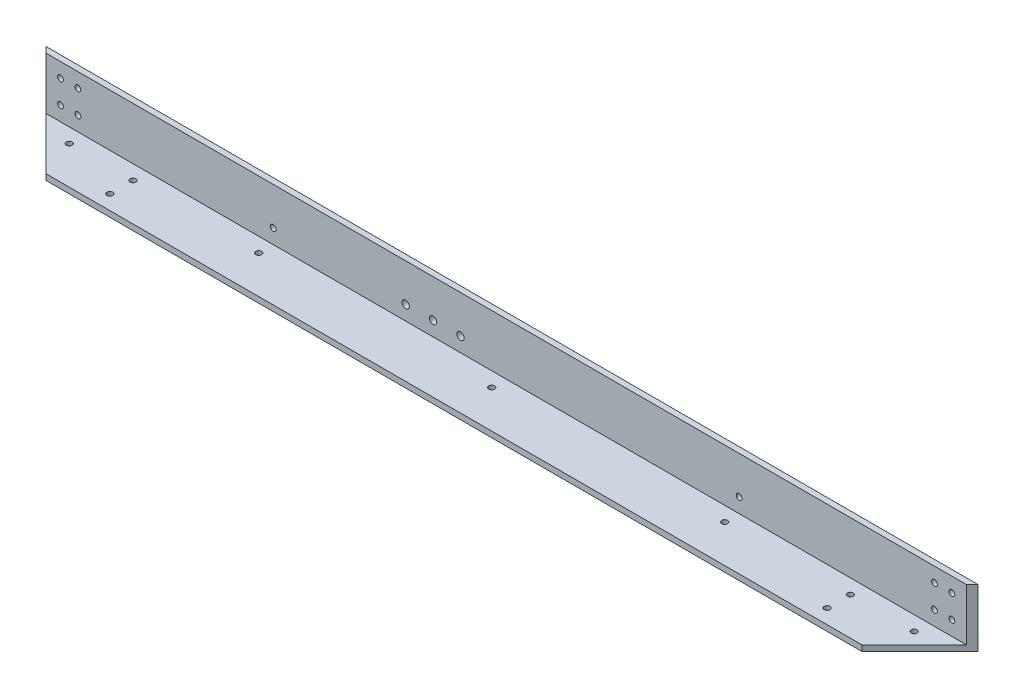
ISO-10303-21;
HEADER;
FILE_DESCRIPTION(('STEP AP214'),'2;1');
FILE_NAME('part.step','',(''),(''),'','','');
FILE_SCHEMA(('AUTOMOTIVE_DESIGN { 1 0 10303 214 1 1 1 1 }'));
ENDSEC;
DATA;
#1=APPLICATION_CONTEXT('core data for automotive mechanical design processes');
#2=APPLICATION_PROTOCOL_DEFINITION('international standard','automotive_design',2000,#1);
#3=PRODUCT_CONTEXT('',#1,'mechanical');
#4=PRODUCT('Part','Part','',(#3));
#5=PRODUCT_RELATED_PRODUCT_CATEGORY('part','',(#4));
#6=PRODUCT_DEFINITION_FORMATION('','',#4);
#7=PRODUCT_DEFINITION_CONTEXT('part definition',#1,'design');
#8=PRODUCT_DEFINITION('design','',#6,#7);
#9=PRODUCT_DEFINITION_SHAPE('','',#8);
#10=(LENGTH_UNIT() NAMED_UNIT(*) SI_UNIT(.MILLI.,.METRE.));
#11=(NAMED_UNIT(*) PLANE_ANGLE_UNIT() SI_UNIT($,.RADIAN.));
#12=(NAMED_UNIT(*) SI_UNIT($,.STERADIAN.) SOLID_ANGLE_UNIT());
#13=UNCERTAINTY_MEASURE_WITH_UNIT(LENGTH_MEASURE(1.E-05),#10,'distance_accuracy_value','');
#14=(GEOMETRIC_REPRESENTATION_CONTEXT(3) GLOBAL_UNCERTAINTY_ASSIGNED_CONTEXT((#13)) GLOBAL_UNIT_ASSIGNED_CONTEXT((#10,
#11,#12)) REPRESENTATION_CONTEXT('',''));
#15=CARTESIAN_POINT('',(0.,0.,0.));
#16=DIRECTION('',(0.,0.,1.));
#17=DIRECTION('',(1.,0.,0.));
#18=AXIS2_PLACEMENT_3D('',#15,#16,#17);
#19=CARTESIAN_POINT('',(510.,31.75,0.));
#20=DIRECTION('',(0.,0.,1.));
#21=DIRECTION('',(0.,-1.,0.));
#22=AXIS2_PLACEMENT_3D('',#19,#20,#21);
#23=PLANE('',#22);
#24=CARTESIAN_POINT('',(20.6375,11.1125,0.));
#25=DIRECTION('',(0.,0.,1.));
#26=DIRECTION('',(1.,0.,0.));
#27=AXIS2_PLACEMENT_3D('',#24,#25,#26);
#28=CIRCLE('',#27,1.5875);
#29=CARTESIAN_POINT('',(22.225,11.1125,0.));
#30=VERTEX_POINT('',#29);
#31=EDGE_CURVE('E325',#30,#30,#28,.T.);
#32=ORIENTED_EDGE('',*,*,#31,.T.);
#33=EDGE_LOOP('',(#32));
#34=FACE_BOUND('',#33,.T.);
#35=CARTESIAN_POINT('',(489.3625,11.1125,0.));
#36=DIRECTION('',(0.,0.,1.));
#37=DIRECTION('',(1.,0.,0.));
#38=AXIS2_PLACEMENT_3D('',#35,#36,#37);
#39=CIRCLE('',#38,1.58750000000004);
#40=CARTESIAN_POINT('',(490.95,11.1125,0.));
#41=VERTEX_POINT('',#40);
#42=EDGE_CURVE('E312',#41,#41,#39,.T.);
#43=ORIENTED_EDGE('',*,*,#42,.T.);
#44=EDGE_LOOP('',(#43));
#45=FACE_BOUND('',#44,.T.);
#46=CARTESIAN_POINT('',(498.8875,11.1125,0.));
#47=DIRECTION('',(0.,0.,1.));
#48=DIRECTION('',(1.,0.,0.));
#49=AXIS2_PLACEMENT_3D('',#46,#47,#48);
#50=CIRCLE('',#49,1.58749999999999);
#51=CARTESIAN_POINT('',(500.475,11.1125,0.));
#52=VERTEX_POINT('',#51);
#53=EDGE_CURVE('E313',#52,#52,#50,.T.);
#54=ORIENTED_EDGE('',*,*,#53,.T.);
#55=EDGE_LOOP('',(#54));
#56=FACE_BOUND('',#55,.T.);
#57=CARTESIAN_POINT('',(200.,11.1125,0.));
#58=DIRECTION('',(0.,0.,1.));
#59=DIRECTION('',(1.,0.,0.));
#60=AXIS2_PLACEMENT_3D('',#57,#58,#59);
#61=CIRCLE('',#60,2.);
#62=CARTESIAN_POINT('',(202.,11.1125,0.));
#63=VERTEX_POINT('',#62);
#64=EDGE_CURVE('E303',#63,#63,#61,.T.);
#65=ORIENTED_EDGE('',*,*,#64,.T.);
#66=EDGE_LOOP('',(#65));
#67=FACE_BOUND('',#66,.T.);
#68=CARTESIAN_POINT('',(11.1125,11.1125,0.));
#69=DIRECTION('',(0.,0.,1.));
#70=DIRECTION('',(1.,0.,0.));
#71=AXIS2_PLACEMENT_3D('',#68,#69,#70);
#72=CIRCLE('',#71,1.5875);
#73=CARTESIAN_POINT('',(12.7,11.1125,0.));
#74=VERTEX_POINT('',#73);
#75=EDGE_CURVE('E324',#74,#74,#72,.T.);
#76=ORIENTED_EDGE('',*,*,#75,.T.);
#77=EDGE_LOOP('',(#76));
#78=FACE_BOUND('',#77,.T.);
#79=CARTESIAN_POINT('',(20.6375,23.8125,0.));
#80=DIRECTION('',(0.,0.,1.));
#81=DIRECTION('',(1.,0.,0.));
#82=AXIS2_PLACEMENT_3D('',#79,#80,#81);
#83=CIRCLE('',#82,1.5875);
#84=CARTESIAN_POINT('',(22.225,23.8125,0.));
#85=VERTEX_POINT('',#84);
#86=EDGE_CURVE('E348',#85,#85,#83,.T.);
#87=ORIENTED_EDGE('',*,*,#86,.T.);
#88=EDGE_LOOP('',(#87));
#89=FACE_BOUND('',#88,.T.);
#90=CARTESIAN_POINT('',(489.3625,23.8125,0.));
#91=DIRECTION('',(0.,0.,1.));
#92=DIRECTION('',(1.,0.,0.));
#93=AXIS2_PLACEMENT_3D('',#90,#91,#92);
#94=CIRCLE('',#93,1.58750000000004);
#95=CARTESIAN_POINT('',(490.95,23.8125,0.));
#96=VERTEX_POINT('',#95);
#97=EDGE_CURVE('E342',#96,#96,#94,.T.);
#98=ORIENTED_EDGE('',*,*,#97,.T.);
#99=EDGE_LOOP('',(#98));
#100=FACE_BOUND('',#99,.T.);
#101=CARTESIAN_POINT('',(498.8875,23.8125,0.));
#102=DIRECTION('',(0.,0.,1.));
#103=DIRECTION('',(1.,0.,0.));
#104=AXIS2_PLACEMENT_3D('',#101,#102,#103);
#105=CIRCLE('',#104,1.58749999999999);
#106=CARTESIAN_POINT('',(500.475,23.8125,0.));
#107=VERTEX_POINT('',#106);
#108=EDGE_CURVE('E336',#107,#107,#105,.T.);
#109=ORIENTED_EDGE('',*,*,#108,.T.);
#110=EDGE_LOOP('',(#109));
#111=FACE_BOUND('',#110,.T.);
#112=CARTESIAN_POINT('',(382.5,11.1125,0.));
#113=DIRECTION('',(0.,0.,1.));
#114=DIRECTION('',(1.,0.,0.));
#115=AXIS2_PLACEMENT_3D('',#112,#113,#114);
#116=CIRCLE('',#115,1.58750000000004);
#117=CARTESIAN_POINT('',(384.0875,11.1125,0.));
#118=VERTEX_POINT('',#117);
#119=EDGE_CURVE('E297',#118,#118,#116,.T.);
#120=ORIENTED_EDGE('',*,*,#119,.T.);
#121=EDGE_LOOP('',(#120));
#122=FACE_BOUND('',#121,.T.);
#123=CARTESIAN_POINT('',(127.5,11.1125,0.));
#124=DIRECTION('',(0.,0.,1.));
#125=DIRECTION('',(1.,0.,0.));
#126=AXIS2_PLACEMENT_3D('',#123,#124,#125);
#127=CIRCLE('',#126,1.58749999999998);
#128=CARTESIAN_POINT('',(129.0875,11.1125,0.));
#129=VERTEX_POINT('',#128);
#130=EDGE_CURVE('E282',#129,#129,#127,.T.);
#131=ORIENTED_EDGE('',*,*,#130,.T.);
#132=EDGE_LOOP('',(#131));
#133=FACE_BOUND('',#132,.T.);
#134=CARTESIAN_POINT('',(230.,11.1125,0.));
#135=DIRECTION('',(0.,0.,1.));
#136=DIRECTION('',(1.,0.,0.));
#137=AXIS2_PLACEMENT_3D('',#134,#135,#136);
#138=CIRCLE('',#137,2.);
#139=CARTESIAN_POINT('',(232.,11.1125,0.));
#140=VERTEX_POINT('',#139);
#141=EDGE_CURVE('E287',#140,#140,#138,.T.);
#142=ORIENTED_EDGE('',*,*,#141,.T.);
#143=EDGE_LOOP('',(#142));
#144=FACE_BOUND('',#143,.T.);
#145=CARTESIAN_POINT('',(215.,11.1125,0.));
#146=DIRECTION('',(0.,0.,1.));
#147=DIRECTION('',(1.,0.,0.));
#148=AXIS2_PLACEMENT_3D('',#145,#146,#147);
#149=CIRCLE('',#148,2.);
#150=CARTESIAN_POINT('',(217.,11.1125,0.));
#151=VERTEX_POINT('',#150);
#152=EDGE_CURVE('E304',#151,#151,#149,.T.);
#153=ORIENTED_EDGE('',*,*,#152,.T.);
#154=EDGE_LOOP('',(#153));
#155=FACE_BOUND('',#154,.T.);
#156=CARTESIAN_POINT('',(11.1125,23.8125,0.));
#157=DIRECTION('',(0.,0.,1.));
#158=DIRECTION('',(1.,0.,0.));
#159=AXIS2_PLACEMENT_3D('',#156,#157,#158);
#160=CIRCLE('',#159,1.5875);
#161=CARTESIAN_POINT('',(12.7,23.8125,0.));
#162=VERTEX_POINT('',#161);
#163=EDGE_CURVE('E356',#162,#162,#160,.T.);
#164=ORIENTED_EDGE('',*,*,#163,.T.);
#165=EDGE_LOOP('',(#164));
#166=FACE_BOUND('',#165,.T.);
#167=DIRECTION('',(0.,1.,0.));
#168=VECTOR('',#167,1.);
#169=CARTESIAN_POINT('',(0.,31.75,0.));
#170=LINE('',#169,#168);
#171=CARTESIAN_POINT('',(0.,0.,0.));
#172=VERTEX_POINT('',#171);
#173=CARTESIAN_POINT('',(0.,31.75,0.));
#174=VERTEX_POINT('',#173);
#175=EDGE_CURVE('E107',#172,#174,#170,.T.);
#176=ORIENTED_EDGE('',*,*,#175,.T.);
#177=DIRECTION('',(-1.,0.,0.));
#178=VECTOR('',#177,1.);
#179=CARTESIAN_POINT('',(510.,31.75,0.));
#180=LINE('',#179,#178);
#181=CARTESIAN_POINT('',(510.,31.75,0.));
#182=VERTEX_POINT('',#181);
#183=EDGE_CURVE('E93',#182,#174,#180,.T.);
#184=ORIENTED_EDGE('',*,*,#183,.F.);
#185=DIRECTION('',(0.,1.,0.));
#186=VECTOR('',#185,1.);
#187=CARTESIAN_POINT('',(510.,31.75,0.));
#188=LINE('',#187,#186);
#189=CARTESIAN_POINT('',(510.,0.,0.));
#190=VERTEX_POINT('',#189);
#191=EDGE_CURVE('E105',#190,#182,#188,.T.);
#192=ORIENTED_EDGE('',*,*,#191,.F.);
#193=DIRECTION('',(-1.,0.,0.));
#194=VECTOR('',#193,1.);
#195=CARTESIAN_POINT('',(510.,0.,0.));
#196=LINE('',#195,#194);
#197=EDGE_CURVE('E114',#190,#172,#196,.T.);
#198=ORIENTED_EDGE('',*,*,#197,.T.);
#199=EDGE_LOOP('',(#176,#184,#192,#198));
#200=FACE_BOUND('',#199,.T.);
#201=ADVANCED_FACE('F38',(#34,#45,#56,#67,#78,#89,#100,#111,#122,#133,#144,#155,#166,#200),#23,.F.);
#202=CARTESIAN_POINT('',(510.,31.75,3.17499999999997));
#203=DIRECTION('',(0.,-1.,0.));
#204=DIRECTION('',(0.,0.,-1.));
#205=AXIS2_PLACEMENT_3D('',#202,#203,#204);
#206=PLANE('',#205);
#207=ORIENTED_EDGE('',*,*,#183,.T.);
#208=DIRECTION('',(0.707106781186546,0.,0.707106781186549));
#209=VECTOR('',#208,1.);
#210=CARTESIAN_POINT('',(31.75,31.75,31.75));
#211=LINE('',#210,#209);
#212=CARTESIAN_POINT('',(3.17500000000004,31.75,3.17499999999997));
#213=VERTEX_POINT('',#212);
#214=EDGE_CURVE('E61',#174,#213,#211,.T.);
#215=ORIENTED_EDGE('',*,*,#214,.T.);
#216=DIRECTION('',(-1.,0.,0.));
#217=VECTOR('',#216,1.);
#218=CARTESIAN_POINT('',(510.,31.75,3.17499999999997));
#219=LINE('',#218,#217);
#220=CARTESIAN_POINT('',(506.825,31.75,3.17499999999997));
#221=VERTEX_POINT('',#220);
#222=EDGE_CURVE('E95',#221,#213,#219,.T.);
#223=ORIENTED_EDGE('',*,*,#222,.F.);
#224=DIRECTION('',(-0.707106781186548,0.,0.707106781186547));
#225=VECTOR('',#224,1.);
#226=CARTESIAN_POINT('',(510.,31.75,0.));
#227=LINE('',#226,#225);
#228=EDGE_CURVE('E90',#221,#182,#227,.F.);
#229=ORIENTED_EDGE('',*,*,#228,.T.);
#230=EDGE_LOOP('',(#207,#215,#223,#229));
#231=FACE_BOUND('',#230,.T.);
#232=ADVANCED_FACE('F92',(#231),#206,.F.);
#233=CARTESIAN_POINT('',(510.,3.17499999999996,3.175));
#234=DIRECTION('',(0.,0.,-1.));
#235=DIRECTION('',(0.,1.,0.));
#236=AXIS2_PLACEMENT_3D('',#233,#234,#235);
#237=PLANE('',#236);
#238=CARTESIAN_POINT('',(20.6375,11.1125,3.17500000000001));
#239=DIRECTION('',(0.,0.,1.));
#240=DIRECTION('',(1.,0.,0.));
#241=AXIS2_PLACEMENT_3D('',#238,#239,#240);
#242=CIRCLE('',#241,1.5875);
#243=CARTESIAN_POINT('',(22.225,11.1125,3.17500000000001));
#244=VERTEX_POINT('',#243);
#245=EDGE_CURVE('E321',#244,#244,#242,.T.);
#246=ORIENTED_EDGE('',*,*,#245,.F.);
#247=EDGE_LOOP('',(#246));
#248=FACE_BOUND('',#247,.T.);
#249=CARTESIAN_POINT('',(489.3625,11.1125,3.17500000000001));
#250=DIRECTION('',(0.,0.,1.));
#251=DIRECTION('',(1.,0.,0.));
#252=AXIS2_PLACEMENT_3D('',#249,#250,#251);
#253=CIRCLE('',#252,1.58750000000004);
#254=CARTESIAN_POINT('',(490.95,11.1125,3.17500000000001));
#255=VERTEX_POINT('',#254);
#256=EDGE_CURVE('E327',#255,#255,#253,.T.);
#257=ORIENTED_EDGE('',*,*,#256,.F.);
#258=EDGE_LOOP('',(#257));
#259=FACE_BOUND('',#258,.T.);
#260=CARTESIAN_POINT('',(498.8875,11.1125,3.17500000000001));
#261=DIRECTION('',(0.,0.,1.));
#262=DIRECTION('',(1.,0.,0.));
#263=AXIS2_PLACEMENT_3D('',#260,#261,#262);
#264=CIRCLE('',#263,1.58749999999999);
#265=CARTESIAN_POINT('',(500.475,11.1125,3.17500000000001));
#266=VERTEX_POINT('',#265);
#267=EDGE_CURVE('E309',#266,#266,#264,.T.);
#268=ORIENTED_EDGE('',*,*,#267,.F.);
#269=EDGE_LOOP('',(#268));
#270=FACE_BOUND('',#269,.T.);
#271=CARTESIAN_POINT('',(200.,11.1125,3.17500000000001));
#272=DIRECTION('',(0.,0.,1.));
#273=DIRECTION('',(1.,0.,0.));
#274=AXIS2_PLACEMENT_3D('',#271,#272,#273);
#275=CIRCLE('',#274,2.);
#276=CARTESIAN_POINT('',(202.,11.1125,3.17500000000001));
#277=VERTEX_POINT('',#276);
#278=EDGE_CURVE('E316',#277,#277,#275,.T.);
#279=ORIENTED_EDGE('',*,*,#278,.F.);
#280=EDGE_LOOP('',(#279));
#281=FACE_BOUND('',#280,.T.);
#282=CARTESIAN_POINT('',(11.1125,11.1125,3.17500000000001));
#283=DIRECTION('',(0.,0.,1.));
#284=DIRECTION('',(1.,0.,0.));
#285=AXIS2_PLACEMENT_3D('',#282,#283,#284);
#286=CIRCLE('',#285,1.5875);
#287=CARTESIAN_POINT('',(12.7,11.1125,3.17500000000001));
#288=VERTEX_POINT('',#287);
#289=EDGE_CURVE('E351',#288,#288,#286,.T.);
#290=ORIENTED_EDGE('',*,*,#289,.F.);
#291=EDGE_LOOP('',(#290));
#292=FACE_BOUND('',#291,.T.);
#293=CARTESIAN_POINT('',(20.6375,23.8125,3.17500000000001));
#294=DIRECTION('',(0.,0.,1.));
#295=DIRECTION('',(1.,0.,0.));
#296=AXIS2_PLACEMENT_3D('',#293,#294,#295);
#297=CIRCLE('',#296,1.5875);
#298=CARTESIAN_POINT('',(22.225,23.8125,3.17500000000001));
#299=VERTEX_POINT('',#298);
#300=EDGE_CURVE('E345',#299,#299,#297,.T.);
#301=ORIENTED_EDGE('',*,*,#300,.F.);
#302=EDGE_LOOP('',(#301));
#303=FACE_BOUND('',#302,.T.);
#304=CARTESIAN_POINT('',(489.3625,23.8125,3.17500000000001));
#305=DIRECTION('',(0.,0.,1.));
#306=DIRECTION('',(1.,0.,0.));
#307=AXIS2_PLACEMENT_3D('',#304,#305,#306);
#308=CIRCLE('',#307,1.58750000000004);
#309=CARTESIAN_POINT('',(490.95,23.8125,3.17500000000001));
#310=VERTEX_POINT('',#309);
#311=EDGE_CURVE('E339',#310,#310,#308,.T.);
#312=ORIENTED_EDGE('',*,*,#311,.F.);
#313=EDGE_LOOP('',(#312));
#314=FACE_BOUND('',#313,.T.);
#315=CARTESIAN_POINT('',(498.8875,23.8125,3.17500000000001));
#316=DIRECTION('',(0.,0.,1.));
#317=DIRECTION('',(1.,0.,0.));
#318=AXIS2_PLACEMENT_3D('',#315,#316,#317);
#319=CIRCLE('',#318,1.58749999999999);
#320=CARTESIAN_POINT('',(500.475,23.8125,3.17500000000001));
#321=VERTEX_POINT('',#320);
#322=EDGE_CURVE('E332',#321,#321,#319,.T.);
#323=ORIENTED_EDGE('',*,*,#322,.F.);
#324=EDGE_LOOP('',(#323));
#325=FACE_BOUND('',#324,.T.);
#326=CARTESIAN_POINT('',(382.5,11.1125,3.17500000000001));
#327=DIRECTION('',(0.,0.,1.));
#328=DIRECTION('',(1.,0.,0.));
#329=AXIS2_PLACEMENT_3D('',#326,#327,#328);
#330=CIRCLE('',#329,1.58750000000004);
#331=CARTESIAN_POINT('',(384.0875,11.1125,3.17500000000001));
#332=VERTEX_POINT('',#331);
#333=EDGE_CURVE('E292',#332,#332,#330,.T.);
#334=ORIENTED_EDGE('',*,*,#333,.F.);
#335=EDGE_LOOP('',(#334));
#336=FACE_BOUND('',#335,.T.);
#337=CARTESIAN_POINT('',(127.5,11.1125,3.17500000000001));
#338=DIRECTION('',(0.,0.,1.));
#339=DIRECTION('',(1.,0.,0.));
#340=AXIS2_PLACEMENT_3D('',#337,#338,#339);
#341=CIRCLE('',#340,1.58749999999998);
#342=CARTESIAN_POINT('',(129.0875,11.1125,3.17500000000001));
#343=VERTEX_POINT('',#342);
#344=EDGE_CURVE('E285',#343,#343,#341,.T.);
#345=ORIENTED_EDGE('',*,*,#344,.F.);
#346=EDGE_LOOP('',(#345));
#347=FACE_BOUND('',#346,.T.);
#348=CARTESIAN_POINT('',(230.,11.1125,3.17500000000001));
#349=DIRECTION('',(0.,0.,1.));
#350=DIRECTION('',(1.,0.,0.));
#351=AXIS2_PLACEMENT_3D('',#348,#349,#350);
#352=CIRCLE('',#351,2.);
#353=CARTESIAN_POINT('',(232.,11.1125,3.17500000000001));
#354=VERTEX_POINT('',#353);
#355=EDGE_CURVE('E290',#354,#354,#352,.T.);
#356=ORIENTED_EDGE('',*,*,#355,.F.);
#357=EDGE_LOOP('',(#356));
#358=FACE_BOUND('',#357,.T.);
#359=CARTESIAN_POINT('',(215.,11.1125,3.17500000000001));
#360=DIRECTION('',(0.,0.,1.));
#361=DIRECTION('',(1.,0.,0.));
#362=AXIS2_PLACEMENT_3D('',#359,#360,#361);
#363=CIRCLE('',#362,2.);
#364=CARTESIAN_POINT('',(217.,11.1125,3.17500000000001));
#365=VERTEX_POINT('',#364);
#366=EDGE_CURVE('E300',#365,#365,#363,.T.);
#367=ORIENTED_EDGE('',*,*,#366,.F.);
#368=EDGE_LOOP('',(#367));
#369=FACE_BOUND('',#368,.T.);
#370=CARTESIAN_POINT('',(11.1125,23.8125,3.17500000000001));
#371=DIRECTION('',(0.,0.,1.));
#372=DIRECTION('',(1.,0.,0.));
#373=AXIS2_PLACEMENT_3D('',#370,#371,#372);
#374=CIRCLE('',#373,1.5875);
#375=CARTESIAN_POINT('',(12.7,23.8125,3.17500000000001));
#376=VERTEX_POINT('',#375);
#377=EDGE_CURVE('E335',#376,#376,#374,.T.);
#378=ORIENTED_EDGE('',*,*,#377,.F.);
#379=EDGE_LOOP('',(#378));
#380=FACE_BOUND('',#379,.T.);
#381=ORIENTED_EDGE('',*,*,#222,.T.);
#382=DIRECTION('',(0.,-1.,0.));
#383=VECTOR('',#382,1.);
#384=CARTESIAN_POINT('',(3.17500000000014,0.,3.17500000000001));
#385=LINE('',#384,#383);
#386=CARTESIAN_POINT('',(3.17500000000004,3.17499999999996,3.175));
#387=VERTEX_POINT('',#386);
#388=EDGE_CURVE('E47',#213,#387,#385,.T.);
#389=ORIENTED_EDGE('',*,*,#388,.T.);
#390=DIRECTION('',(-1.,0.,0.));
#391=VECTOR('',#390,1.);
#392=CARTESIAN_POINT('',(510.,3.17499999999996,3.175));
#393=LINE('',#392,#391);
#394=CARTESIAN_POINT('',(506.825,3.17499999999996,3.175));
#395=VERTEX_POINT('',#394);
#396=EDGE_CURVE('E129',#395,#387,#393,.T.);
#397=ORIENTED_EDGE('',*,*,#396,.F.);
#398=DIRECTION('',(0.,-1.,0.));
#399=VECTOR('',#398,1.);
#400=CARTESIAN_POINT('',(506.825,0.,3.17500000000001));
#401=LINE('',#400,#399);
#402=EDGE_CURVE('E100',#395,#221,#401,.F.);
#403=ORIENTED_EDGE('',*,*,#402,.T.);
#404=EDGE_LOOP('',(#381,#389,#397,#403));
#405=FACE_BOUND('',#404,.T.);
#406=ADVANCED_FACE('F153',(#248,#259,#270,#281,#292,#303,#314,#325,#336,#347,#358,#369,#380,
#405),#237,.F.);
#407=CARTESIAN_POINT('',(510.,3.17499999999996,31.75));
#408=DIRECTION('',(0.,-1.,0.));
#409=DIRECTION('',(0.,0.,-1.));
#410=AXIS2_PLACEMENT_3D('',#407,#408,#409);
#411=PLANE('',#410);
#412=CARTESIAN_POINT('',(255.,3.17499999999996,11.1125));
#413=DIRECTION('',(0.,1.,0.));
#414=DIRECTION('',(0.,0.,1.));
#415=AXIS2_PLACEMENT_3D('',#412,#413,#414);
#416=CIRCLE('',#415,1.58750000000004);
#417=CARTESIAN_POINT('',(255.,3.17499999999996,12.7));
#418=VERTEX_POINT('',#417);
#419=EDGE_CURVE('E386',#418,#418,#416,.T.);
#420=ORIENTED_EDGE('',*,*,#419,.F.);
#421=EDGE_LOOP('',(#420));
#422=FACE_BOUND('',#421,.T.);
#423=CARTESIAN_POINT('',(382.5,3.17499999999996,11.1125));
#424=DIRECTION('',(0.,1.,0.));
#425=DIRECTION('',(0.,0.,1.));
#426=AXIS2_PLACEMENT_3D('',#423,#424,#425);
#427=CIRCLE('',#426,1.58750000000004);
#428=CARTESIAN_POINT('',(382.5,3.17499999999996,12.7));
#429=VERTEX_POINT('',#428);
#430=EDGE_CURVE('E391',#429,#429,#427,.T.);
#431=ORIENTED_EDGE('',*,*,#430,.F.);
#432=EDGE_LOOP('',(#431));
#433=FACE_BOUND('',#432,.T.);
#434=CARTESIAN_POINT('',(451.2625,3.17499999999996,23.8125));
#435=DIRECTION('',(0.,1.,0.));
#436=DIRECTION('',(0.,0.,1.));
#437=AXIS2_PLACEMENT_3D('',#434,#435,#436);
#438=CIRCLE('',#437,1.58750000000004);
#439=CARTESIAN_POINT('',(451.2625,3.17499999999996,25.4));
#440=VERTEX_POINT('',#439);
#441=EDGE_CURVE('E397',#440,#440,#438,.T.);
#442=ORIENTED_EDGE('',*,*,#441,.F.);
#443=EDGE_LOOP('',(#442));
#444=FACE_BOUND('',#443,.T.);
#445=CARTESIAN_POINT('',(451.2625,3.17499999999996,11.1125));
#446=DIRECTION('',(0.,1.,0.));
#447=DIRECTION('',(0.,0.,1.));
#448=AXIS2_PLACEMENT_3D('',#445,#446,#447);
#449=CIRCLE('',#448,1.58750000000004);
#450=CARTESIAN_POINT('',(451.2625,3.17499999999996,12.7));
#451=VERTEX_POINT('',#450);
#452=EDGE_CURVE('E403',#451,#451,#449,.T.);
#453=ORIENTED_EDGE('',*,*,#452,.F.);
#454=EDGE_LOOP('',(#453));
#455=FACE_BOUND('',#454,.T.);
#456=CARTESIAN_POINT('',(23.8125,3.17499999999996,11.1125));
#457=DIRECTION('',(0.,1.,0.));
#458=DIRECTION('',(0.,0.,1.));
#459=AXIS2_PLACEMENT_3D('',#456,#457,#458);
#460=CIRCLE('',#459,1.5875);
#461=CARTESIAN_POINT('',(23.8125,3.17499999999996,12.7));
#462=VERTEX_POINT('',#461);
#463=EDGE_CURVE('E369',#462,#462,#460,.T.);
#464=ORIENTED_EDGE('',*,*,#463,.F.);
#465=EDGE_LOOP('',(#464));
#466=FACE_BOUND('',#465,.T.);
#467=CARTESIAN_POINT('',(486.1875,3.17499999999996,11.1125));
#468=DIRECTION('',(0.,1.,0.));
#469=DIRECTION('',(0.,0.,1.));
#470=AXIS2_PLACEMENT_3D('',#467,#468,#469);
#471=CIRCLE('',#470,1.58750000000004);
#472=CARTESIAN_POINT('',(486.1875,3.17499999999996,12.7));
#473=VERTEX_POINT('',#472);
#474=EDGE_CURVE('E362',#473,#473,#471,.T.);
#475=ORIENTED_EDGE('',*,*,#474,.F.);
#476=EDGE_LOOP('',(#475));
#477=FACE_BOUND('',#476,.T.);
#478=CARTESIAN_POINT('',(58.7375,3.17499999999996,11.1125));
#479=DIRECTION('',(0.,1.,0.));
#480=DIRECTION('',(0.,0.,1.));
#481=AXIS2_PLACEMENT_3D('',#478,#479,#480);
#482=CIRCLE('',#481,1.5875);
#483=CARTESIAN_POINT('',(58.7375,3.17499999999996,12.7));
#484=VERTEX_POINT('',#483);
#485=EDGE_CURVE('E381',#484,#484,#482,.T.);
#486=ORIENTED_EDGE('',*,*,#485,.F.);
#487=EDGE_LOOP('',(#486));
#488=FACE_BOUND('',#487,.T.);
#489=CARTESIAN_POINT('',(58.7375,3.17499999999996,23.8125));
#490=DIRECTION('',(0.,1.,0.));
#491=DIRECTION('',(0.,0.,1.));
#492=AXIS2_PLACEMENT_3D('',#489,#490,#491);
#493=CIRCLE('',#492,1.58749999999998);
#494=CARTESIAN_POINT('',(58.7375,3.17499999999996,25.3999999999999));
#495=VERTEX_POINT('',#494);
#496=EDGE_CURVE('E374',#495,#495,#493,.T.);
#497=ORIENTED_EDGE('',*,*,#496,.F.);
#498=EDGE_LOOP('',(#497));
#499=FACE_BOUND('',#498,.T.);
#500=CARTESIAN_POINT('',(127.5,3.17499999999996,11.1125));
#501=DIRECTION('',(0.,1.,0.));
#502=DIRECTION('',(0.,0.,1.));
#503=AXIS2_PLACEMENT_3D('',#500,#501,#502);
#504=CIRCLE('',#503,1.58749999999998);
#505=CARTESIAN_POINT('',(127.5,3.17499999999996,12.7));
#506=VERTEX_POINT('',#505);
#507=EDGE_CURVE('E121',#506,#506,#504,.T.);
#508=ORIENTED_EDGE('',*,*,#507,.F.);
#509=EDGE_LOOP('',(#508));
#510=FACE_BOUND('',#509,.T.);
#511=ORIENTED_EDGE('',*,*,#396,.T.);
#512=DIRECTION('',(0.707106781186546,0.,0.707106781186549));
#513=VECTOR('',#512,1.);
#514=CARTESIAN_POINT('',(31.75,3.17499999999996,31.75));
#515=LINE('',#514,#513);
#516=CARTESIAN_POINT('',(31.75,3.17499999999996,31.75));
#517=VERTEX_POINT('',#516);
#518=EDGE_CURVE('E11',#387,#517,#515,.T.);
#519=ORIENTED_EDGE('',*,*,#518,.T.);
#520=DIRECTION('',(-1.,0.,0.));
#521=VECTOR('',#520,1.);
#522=CARTESIAN_POINT('',(510.,3.17499999999996,31.75));
#523=LINE('',#522,#521);
#524=CARTESIAN_POINT('',(478.25,3.17499999999996,31.75));
#525=VERTEX_POINT('',#524);
#526=EDGE_CURVE('E126',#525,#517,#523,.T.);
#527=ORIENTED_EDGE('',*,*,#526,.F.);
#528=DIRECTION('',(-0.707106781186548,0.,0.707106781186547));
#529=VECTOR('',#528,1.);
#530=CARTESIAN_POINT('',(510.,3.17499999999996,0.));
#531=LINE('',#530,#529);
#532=EDGE_CURVE('E135',#525,#395,#531,.F.);
#533=ORIENTED_EDGE('',*,*,#532,.T.);
#534=EDGE_LOOP('',(#511,#519,#527,#533));
#535=FACE_BOUND('',#534,.T.);
#536=ADVANCED_FACE('F150',(#422,#433,#444,#455,#466,#477,#488,#499,#510,#535),#411,.F.);
#537=CARTESIAN_POINT('',(510.,0.,31.75));
#538=DIRECTION('',(0.,0.,-1.));
#539=DIRECTION('',(-1.,0.,0.));
#540=AXIS2_PLACEMENT_3D('',#537,#538,#539);
#541=PLANE('',#540);
#542=ORIENTED_EDGE('',*,*,#526,.T.);
#543=DIRECTION('',(0.,-1.,0.));
#544=VECTOR('',#543,1.);
#545=CARTESIAN_POINT('',(31.75,0.,31.75));
#546=LINE('',#545,#544);
#547=CARTESIAN_POINT('',(31.75,0.,31.75));
#548=VERTEX_POINT('',#547);
#549=EDGE_CURVE('E99',#517,#548,#546,.T.);
#550=ORIENTED_EDGE('',*,*,#549,.T.);
#551=DIRECTION('',(-1.,0.,0.));
#552=VECTOR('',#551,1.);
#553=CARTESIAN_POINT('',(510.,0.,31.75));
#554=LINE('',#553,#552);
#555=CARTESIAN_POINT('',(478.25,0.,31.75));
#556=VERTEX_POINT('',#555);
#557=EDGE_CURVE('E116',#556,#548,#554,.T.);
#558=ORIENTED_EDGE('',*,*,#557,.F.);
#559=DIRECTION('',(0.,1.,0.));
#560=VECTOR('',#559,1.);
#561=CARTESIAN_POINT('',(478.25,0.,31.75));
#562=LINE('',#561,#560);
#563=EDGE_CURVE('E133',#556,#525,#562,.T.);
#564=ORIENTED_EDGE('',*,*,#563,.T.);
#565=EDGE_LOOP('',(#542,#550,#558,#564));
#566=FACE_BOUND('',#565,.T.);
#567=ADVANCED_FACE('F152',(#566),#541,.F.);
#568=CARTESIAN_POINT('',(510.,0.,0.));
#569=DIRECTION('',(0.,1.,0.));
#570=DIRECTION('',(0.,0.,1.));
#571=AXIS2_PLACEMENT_3D('',#568,#569,#570);
#572=PLANE('',#571);
#573=CARTESIAN_POINT('',(255.,0.,11.1125));
#574=DIRECTION('',(0.,1.,0.));
#575=DIRECTION('',(0.,0.,1.));
#576=AXIS2_PLACEMENT_3D('',#573,#574,#575);
#577=CIRCLE('',#576,1.58750000000004);
#578=CARTESIAN_POINT('',(255.,0.,12.7));
#579=VERTEX_POINT('',#578);
#580=EDGE_CURVE('E389',#579,#579,#577,.T.);
#581=ORIENTED_EDGE('',*,*,#580,.T.);
#582=EDGE_LOOP('',(#581));
#583=FACE_BOUND('',#582,.T.);
#584=CARTESIAN_POINT('',(382.5,0.,11.1125));
#585=DIRECTION('',(0.,1.,0.));
#586=DIRECTION('',(0.,0.,1.));
#587=AXIS2_PLACEMENT_3D('',#584,#585,#586);
#588=CIRCLE('',#587,1.58750000000004);
#589=CARTESIAN_POINT('',(382.5,0.,12.7));
#590=VERTEX_POINT('',#589);
#591=EDGE_CURVE('E394',#590,#590,#588,.T.);
#592=ORIENTED_EDGE('',*,*,#591,.T.);
#593=EDGE_LOOP('',(#592));
#594=FACE_BOUND('',#593,.T.);
#595=CARTESIAN_POINT('',(451.2625,0.,23.8125));
#596=DIRECTION('',(0.,1.,0.));
#597=DIRECTION('',(0.,0.,1.));
#598=AXIS2_PLACEMENT_3D('',#595,#596,#597);
#599=CIRCLE('',#598,1.58750000000004);
#600=CARTESIAN_POINT('',(451.2625,0.,25.4));
#601=VERTEX_POINT('',#600);
#602=EDGE_CURVE('E400',#601,#601,#599,.T.);
#603=ORIENTED_EDGE('',*,*,#602,.T.);
#604=EDGE_LOOP('',(#603));
#605=FACE_BOUND('',#604,.T.);
#606=CARTESIAN_POINT('',(451.2625,0.,11.1125));
#607=DIRECTION('',(0.,1.,0.));
#608=DIRECTION('',(0.,0.,1.));
#609=AXIS2_PLACEMENT_3D('',#606,#607,#608);
#610=CIRCLE('',#609,1.58750000000004);
#611=CARTESIAN_POINT('',(451.2625,0.,12.7));
#612=VERTEX_POINT('',#611);
#613=EDGE_CURVE('E377',#612,#612,#610,.T.);
#614=ORIENTED_EDGE('',*,*,#613,.T.);
#615=EDGE_LOOP('',(#614));
#616=FACE_BOUND('',#615,.T.);
#617=CARTESIAN_POINT('',(23.8125,0.,11.1125));
#618=DIRECTION('',(0.,1.,0.));
#619=DIRECTION('',(0.,0.,1.));
#620=AXIS2_PLACEMENT_3D('',#617,#618,#619);
#621=CIRCLE('',#620,1.5875);
#622=CARTESIAN_POINT('',(23.8125,0.,12.7));
#623=VERTEX_POINT('',#622);
#624=EDGE_CURVE('E359',#623,#623,#621,.T.);
#625=ORIENTED_EDGE('',*,*,#624,.T.);
#626=EDGE_LOOP('',(#625));
#627=FACE_BOUND('',#626,.T.);
#628=CARTESIAN_POINT('',(486.1875,0.,11.1125));
#629=DIRECTION('',(0.,1.,0.));
#630=DIRECTION('',(0.,0.,1.));
#631=AXIS2_PLACEMENT_3D('',#628,#629,#630);
#632=CIRCLE('',#631,1.58750000000004);
#633=CARTESIAN_POINT('',(486.1875,0.,12.7));
#634=VERTEX_POINT('',#633);
#635=EDGE_CURVE('E366',#634,#634,#632,.T.);
#636=ORIENTED_EDGE('',*,*,#635,.T.);
#637=EDGE_LOOP('',(#636));
#638=FACE_BOUND('',#637,.T.);
#639=CARTESIAN_POINT('',(58.7375,0.,11.1125));
#640=DIRECTION('',(0.,1.,0.));
#641=DIRECTION('',(0.,0.,1.));
#642=AXIS2_PLACEMENT_3D('',#639,#640,#641);
#643=CIRCLE('',#642,1.5875);
#644=CARTESIAN_POINT('',(58.7375,0.,12.7));
#645=VERTEX_POINT('',#644);
#646=EDGE_CURVE('E365',#645,#645,#643,.T.);
#647=ORIENTED_EDGE('',*,*,#646,.T.);
#648=EDGE_LOOP('',(#647));
#649=FACE_BOUND('',#648,.T.);
#650=CARTESIAN_POINT('',(58.7375,0.,23.8125));
#651=DIRECTION('',(0.,1.,0.));
#652=DIRECTION('',(0.,0.,1.));
#653=AXIS2_PLACEMENT_3D('',#650,#651,#652);
#654=CIRCLE('',#653,1.58749999999998);
#655=CARTESIAN_POINT('',(58.7375,0.,25.3999999999999));
#656=VERTEX_POINT('',#655);
#657=EDGE_CURVE('E378',#656,#656,#654,.T.);
#658=ORIENTED_EDGE('',*,*,#657,.T.);
#659=EDGE_LOOP('',(#658));
#660=FACE_BOUND('',#659,.T.);
#661=CARTESIAN_POINT('',(127.5,0.,11.1125));
#662=DIRECTION('',(0.,1.,0.));
#663=DIRECTION('',(0.,0.,1.));
#664=AXIS2_PLACEMENT_3D('',#661,#662,#663);
#665=CIRCLE('',#664,1.58749999999998);
#666=CARTESIAN_POINT('',(127.5,0.,12.7));
#667=VERTEX_POINT('',#666);
#668=EDGE_CURVE('E118',#667,#667,#665,.T.);
#669=ORIENTED_EDGE('',*,*,#668,.T.);
#670=EDGE_LOOP('',(#669));
#671=FACE_BOUND('',#670,.T.);
#672=ORIENTED_EDGE('',*,*,#557,.T.);
#673=DIRECTION('',(-0.707106781186546,0.,-0.707106781186549));
#674=VECTOR('',#673,1.);
#675=CARTESIAN_POINT('',(31.75,0.,31.75));
#676=LINE('',#675,#674);
#677=EDGE_CURVE('E140',#548,#172,#676,.T.);
#678=ORIENTED_EDGE('',*,*,#677,.T.);
#679=ORIENTED_EDGE('',*,*,#197,.F.);
#680=DIRECTION('',(0.707106781186548,0.,-0.707106781186547));
#681=VECTOR('',#680,1.);
#682=CARTESIAN_POINT('',(510.,0.,0.));
#683=LINE('',#682,#681);
#684=EDGE_CURVE('E108',#190,#556,#683,.F.);
#685=ORIENTED_EDGE('',*,*,#684,.T.);
#686=EDGE_LOOP('',(#672,#678,#679,#685));
#687=FACE_BOUND('',#686,.T.);
#688=ADVANCED_FACE('F143',(#583,#594,#605,#616,#627,#638,#649,#660,#671,#687),#572,.F.);
#689=CARTESIAN_POINT('',(510.,0.,0.));
#690=DIRECTION('',(-0.707106781186547,0.,-0.707106781186548));
#691=DIRECTION('',(0.,-1.,0.));
#692=AXIS2_PLACEMENT_3D('',#689,#690,#691);
#693=PLANE('',#692);
#694=ORIENTED_EDGE('',*,*,#532,.F.);
#695=ORIENTED_EDGE('',*,*,#563,.F.);
#696=ORIENTED_EDGE('',*,*,#684,.F.);
#697=ORIENTED_EDGE('',*,*,#191,.T.);
#698=ORIENTED_EDGE('',*,*,#228,.F.);
#699=ORIENTED_EDGE('',*,*,#402,.F.);
#700=EDGE_LOOP('',(#694,#695,#696,#697,#698,#699));
#701=FACE_BOUND('',#700,.T.);
#702=ADVANCED_FACE('F111',(#701),#693,.F.);
#703=CARTESIAN_POINT('',(31.75,0.,31.75));
#704=DIRECTION('',(-0.707106781186549,0.,0.707106781186546));
#705=DIRECTION('',(0.,1.,0.));
#706=AXIS2_PLACEMENT_3D('',#703,#704,#705);
#707=PLANE('',#706);
#708=ORIENTED_EDGE('',*,*,#214,.F.);
#709=ORIENTED_EDGE('',*,*,#175,.F.);
#710=ORIENTED_EDGE('',*,*,#677,.F.);
#711=ORIENTED_EDGE('',*,*,#549,.F.);
#712=ORIENTED_EDGE('',*,*,#518,.F.);
#713=ORIENTED_EDGE('',*,*,#388,.F.);
#714=EDGE_LOOP('',(#708,#709,#710,#711,#712,#713));
#715=FACE_BOUND('',#714,.T.);
#716=ADVANCED_FACE('F41',(#715),#707,.T.);
#717=CARTESIAN_POINT('',(127.5,0.,11.1125));
#718=DIRECTION('',(0.,1.,0.));
#719=DIRECTION('',(0.,0.,1.));
#720=AXIS2_PLACEMENT_3D('',#717,#718,#719);
#721=CYLINDRICAL_SURFACE('',#720,1.58749999999998);
#722=ORIENTED_EDGE('',*,*,#668,.F.);
#723=EDGE_LOOP('',(#722));
#724=FACE_BOUND('',#723,.T.);
#725=ORIENTED_EDGE('',*,*,#507,.T.);
#726=EDGE_LOOP('',(#725));
#727=FACE_BOUND('',#726,.T.);
#728=ADVANCED_FACE('F181',(#724,#727),#721,.F.);
#729=CARTESIAN_POINT('',(58.7375,0.,23.8125));
#730=DIRECTION('',(0.,1.,0.));
#731=DIRECTION('',(0.,0.,1.));
#732=AXIS2_PLACEMENT_3D('',#729,#730,#731);
#733=CYLINDRICAL_SURFACE('',#732,1.58749999999998);
#734=ORIENTED_EDGE('',*,*,#657,.F.);
#735=EDGE_LOOP('',(#734));
#736=FACE_BOUND('',#735,.T.);
#737=ORIENTED_EDGE('',*,*,#496,.T.);
#738=EDGE_LOOP('',(#737));
#739=FACE_BOUND('',#738,.T.);
#740=ADVANCED_FACE('F193',(#736,#739),#733,.F.);
#741=CARTESIAN_POINT('',(58.7375,0.,11.1125));
#742=DIRECTION('',(0.,1.,0.));
#743=DIRECTION('',(0.,0.,1.));
#744=AXIS2_PLACEMENT_3D('',#741,#742,#743);
#745=CYLINDRICAL_SURFACE('',#744,1.5875);
#746=ORIENTED_EDGE('',*,*,#646,.F.);
#747=EDGE_LOOP('',(#746));
#748=FACE_BOUND('',#747,.T.);
#749=ORIENTED_EDGE('',*,*,#485,.T.);
#750=EDGE_LOOP('',(#749));
#751=FACE_BOUND('',#750,.T.);
#752=ADVANCED_FACE('F213',(#748,#751),#745,.F.);
#753=CARTESIAN_POINT('',(486.1875,0.,11.1125));
#754=DIRECTION('',(0.,1.,0.));
#755=DIRECTION('',(0.,0.,1.));
#756=AXIS2_PLACEMENT_3D('',#753,#754,#755);
#757=CYLINDRICAL_SURFACE('',#756,1.58750000000004);
#758=ORIENTED_EDGE('',*,*,#635,.F.);
#759=EDGE_LOOP('',(#758));
#760=FACE_BOUND('',#759,.T.);
#761=ORIENTED_EDGE('',*,*,#474,.T.);
#762=EDGE_LOOP('',(#761));
#763=FACE_BOUND('',#762,.T.);
#764=ADVANCED_FACE('F216',(#760,#763),#757,.F.);
#765=CARTESIAN_POINT('',(23.8125,0.,11.1125));
#766=DIRECTION('',(0.,1.,0.));
#767=DIRECTION('',(0.,0.,1.));
#768=AXIS2_PLACEMENT_3D('',#765,#766,#767);
#769=CYLINDRICAL_SURFACE('',#768,1.5875);
#770=ORIENTED_EDGE('',*,*,#624,.F.);
#771=EDGE_LOOP('',(#770));
#772=FACE_BOUND('',#771,.T.);
#773=ORIENTED_EDGE('',*,*,#463,.T.);
#774=EDGE_LOOP('',(#773));
#775=FACE_BOUND('',#774,.T.);
#776=ADVANCED_FACE('F199',(#772,#775),#769,.F.);
#777=CARTESIAN_POINT('',(451.2625,0.,11.1125));
#778=DIRECTION('',(0.,1.,0.));
#779=DIRECTION('',(0.,0.,1.));
#780=AXIS2_PLACEMENT_3D('',#777,#778,#779);
#781=CYLINDRICAL_SURFACE('',#780,1.58750000000004);
#782=ORIENTED_EDGE('',*,*,#613,.F.);
#783=EDGE_LOOP('',(#782));
#784=FACE_BOUND('',#783,.T.);
#785=ORIENTED_EDGE('',*,*,#452,.T.);
#786=EDGE_LOOP('',(#785));
#787=FACE_BOUND('',#786,.T.);
#788=ADVANCED_FACE('F195',(#784,#787),#781,.F.);
#789=CARTESIAN_POINT('',(451.2625,0.,23.8125));
#790=DIRECTION('',(0.,1.,0.));
#791=DIRECTION('',(0.,0.,1.));
#792=AXIS2_PLACEMENT_3D('',#789,#790,#791);
#793=CYLINDRICAL_SURFACE('',#792,1.58750000000004);
#794=ORIENTED_EDGE('',*,*,#602,.F.);
#795=EDGE_LOOP('',(#794));
#796=FACE_BOUND('',#795,.T.);
#797=ORIENTED_EDGE('',*,*,#441,.T.);
#798=EDGE_LOOP('',(#797));
#799=FACE_BOUND('',#798,.T.);
#800=ADVANCED_FACE('F198',(#796,#799),#793,.F.);
#801=CARTESIAN_POINT('',(382.5,0.,11.1125));
#802=DIRECTION('',(0.,1.,0.));
#803=DIRECTION('',(0.,0.,1.));
#804=AXIS2_PLACEMENT_3D('',#801,#802,#803);
#805=CYLINDRICAL_SURFACE('',#804,1.58750000000004);
#806=ORIENTED_EDGE('',*,*,#591,.F.);
#807=EDGE_LOOP('',(#806));
#808=FACE_BOUND('',#807,.T.);
#809=ORIENTED_EDGE('',*,*,#430,.T.);
#810=EDGE_LOOP('',(#809));
#811=FACE_BOUND('',#810,.T.);
#812=ADVANCED_FACE('F203',(#808,#811),#805,.F.);
#813=CARTESIAN_POINT('',(255.,0.,11.1125));
#814=DIRECTION('',(0.,1.,0.));
#815=DIRECTION('',(0.,0.,1.));
#816=AXIS2_PLACEMENT_3D('',#813,#814,#815);
#817=CYLINDRICAL_SURFACE('',#816,1.58750000000004);
#818=ORIENTED_EDGE('',*,*,#580,.F.);
#819=EDGE_LOOP('',(#818));
#820=FACE_BOUND('',#819,.T.);
#821=ORIENTED_EDGE('',*,*,#419,.T.);
#822=EDGE_LOOP('',(#821));
#823=FACE_BOUND('',#822,.T.);
#824=ADVANCED_FACE('F207',(#820,#823),#817,.F.);
#825=CARTESIAN_POINT('',(11.1125,23.8125,0.));
#826=DIRECTION('',(0.,0.,1.));
#827=DIRECTION('',(1.,0.,0.));
#828=AXIS2_PLACEMENT_3D('',#825,#826,#827);
#829=CYLINDRICAL_SURFACE('',#828,1.5875);
#830=ORIENTED_EDGE('',*,*,#163,.F.);
#831=EDGE_LOOP('',(#830));
#832=FACE_BOUND('',#831,.T.);
#833=ORIENTED_EDGE('',*,*,#377,.T.);
#834=EDGE_LOOP('',(#833));
#835=FACE_BOUND('',#834,.T.);
#836=ADVANCED_FACE('F211',(#832,#835),#829,.F.);
#837=CARTESIAN_POINT('',(215.,11.1125,0.));
#838=DIRECTION('',(0.,0.,1.));
#839=DIRECTION('',(1.,0.,0.));
#840=AXIS2_PLACEMENT_3D('',#837,#838,#839);
#841=CYLINDRICAL_SURFACE('',#840,2.);
#842=ORIENTED_EDGE('',*,*,#152,.F.);
#843=EDGE_LOOP('',(#842));
#844=FACE_BOUND('',#843,.T.);
#845=ORIENTED_EDGE('',*,*,#366,.T.);
#846=EDGE_LOOP('',(#845));
#847=FACE_BOUND('',#846,.T.);
#848=ADVANCED_FACE('F229',(#844,#847),#841,.F.);
#849=CARTESIAN_POINT('',(230.,11.1125,0.));
#850=DIRECTION('',(0.,0.,1.));
#851=DIRECTION('',(1.,0.,0.));
#852=AXIS2_PLACEMENT_3D('',#849,#850,#851);
#853=CYLINDRICAL_SURFACE('',#852,2.);
#854=ORIENTED_EDGE('',*,*,#141,.F.);
#855=EDGE_LOOP('',(#854));
#856=FACE_BOUND('',#855,.T.);
#857=ORIENTED_EDGE('',*,*,#355,.T.);
#858=EDGE_LOOP('',(#857));
#859=FACE_BOUND('',#858,.T.);
#860=ADVANCED_FACE('F264',(#856,#859),#853,.F.);
#861=CARTESIAN_POINT('',(127.5,11.1125,0.));
#862=DIRECTION('',(0.,0.,1.));
#863=DIRECTION('',(1.,0.,0.));
#864=AXIS2_PLACEMENT_3D('',#861,#862,#863);
#865=CYLINDRICAL_SURFACE('',#864,1.58749999999998);
#866=ORIENTED_EDGE('',*,*,#130,.F.);
#867=EDGE_LOOP('',(#866));
#868=FACE_BOUND('',#867,.T.);
#869=ORIENTED_EDGE('',*,*,#344,.T.);
#870=EDGE_LOOP('',(#869));
#871=FACE_BOUND('',#870,.T.);
#872=ADVANCED_FACE('F267',(#868,#871),#865,.F.);
#873=CARTESIAN_POINT('',(382.5,11.1125,0.));
#874=DIRECTION('',(0.,0.,1.));
#875=DIRECTION('',(1.,0.,0.));
#876=AXIS2_PLACEMENT_3D('',#873,#874,#875);
#877=CYLINDRICAL_SURFACE('',#876,1.58750000000004);
#878=ORIENTED_EDGE('',*,*,#119,.F.);
#879=EDGE_LOOP('',(#878));
#880=FACE_BOUND('',#879,.T.);
#881=ORIENTED_EDGE('',*,*,#333,.T.);
#882=EDGE_LOOP('',(#881));
#883=FACE_BOUND('',#882,.T.);
#884=ADVANCED_FACE('F247',(#880,#883),#877,.F.);
#885=CARTESIAN_POINT('',(498.8875,23.8125,0.));
#886=DIRECTION('',(0.,0.,1.));
#887=DIRECTION('',(1.,0.,0.));
#888=AXIS2_PLACEMENT_3D('',#885,#886,#887);
#889=CYLINDRICAL_SURFACE('',#888,1.58749999999999);
#890=ORIENTED_EDGE('',*,*,#108,.F.);
#891=EDGE_LOOP('',(#890));
#892=FACE_BOUND('',#891,.T.);
#893=ORIENTED_EDGE('',*,*,#322,.T.);
#894=EDGE_LOOP('',(#893));
#895=FACE_BOUND('',#894,.T.);
#896=ADVANCED_FACE('F243',(#892,#895),#889,.F.);
#897=CARTESIAN_POINT('',(489.3625,23.8125,0.));
#898=DIRECTION('',(0.,0.,1.));
#899=DIRECTION('',(1.,0.,0.));
#900=AXIS2_PLACEMENT_3D('',#897,#898,#899);
#901=CYLINDRICAL_SURFACE('',#900,1.58750000000004);
#902=ORIENTED_EDGE('',*,*,#97,.F.);
#903=EDGE_LOOP('',(#902));
#904=FACE_BOUND('',#903,.T.);
#905=ORIENTED_EDGE('',*,*,#311,.T.);
#906=EDGE_LOOP('',(#905));
#907=FACE_BOUND('',#906,.T.);
#908=ADVANCED_FACE('F239',(#904,#907),#901,.F.);
#909=CARTESIAN_POINT('',(20.6375,23.8125,0.));
#910=DIRECTION('',(0.,0.,1.));
#911=DIRECTION('',(1.,0.,0.));
#912=AXIS2_PLACEMENT_3D('',#909,#910,#911);
#913=CYLINDRICAL_SURFACE('',#912,1.5875);
#914=ORIENTED_EDGE('',*,*,#86,.F.);
#915=EDGE_LOOP('',(#914));
#916=FACE_BOUND('',#915,.T.);
#917=ORIENTED_EDGE('',*,*,#300,.T.);
#918=EDGE_LOOP('',(#917));
#919=FACE_BOUND('',#918,.T.);
#920=ADVANCED_FACE('F235',(#916,#919),#913,.F.);
#921=CARTESIAN_POINT('',(11.1125,11.1125,0.));
#922=DIRECTION('',(0.,0.,1.));
#923=DIRECTION('',(1.,0.,0.));
#924=AXIS2_PLACEMENT_3D('',#921,#922,#923);
#925=CYLINDRICAL_SURFACE('',#924,1.5875);
#926=ORIENTED_EDGE('',*,*,#75,.F.);
#927=EDGE_LOOP('',(#926));
#928=FACE_BOUND('',#927,.T.);
#929=ORIENTED_EDGE('',*,*,#289,.T.);
#930=EDGE_LOOP('',(#929));
#931=FACE_BOUND('',#930,.T.);
#932=ADVANCED_FACE('F231',(#928,#931),#925,.F.);
#933=CARTESIAN_POINT('',(200.,11.1125,0.));
#934=DIRECTION('',(0.,0.,1.));
#935=DIRECTION('',(1.,0.,0.));
#936=AXIS2_PLACEMENT_3D('',#933,#934,#935);
#937=CYLINDRICAL_SURFACE('',#936,2.);
#938=ORIENTED_EDGE('',*,*,#64,.F.);
#939=EDGE_LOOP('',(#938));
#940=FACE_BOUND('',#939,.T.);
#941=ORIENTED_EDGE('',*,*,#278,.T.);
#942=EDGE_LOOP('',(#941));
#943=FACE_BOUND('',#942,.T.);
#944=ADVANCED_FACE('F234',(#940,#943),#937,.F.);
#945=CARTESIAN_POINT('',(498.8875,11.1125,0.));
#946=DIRECTION('',(0.,0.,1.));
#947=DIRECTION('',(1.,0.,0.));
#948=AXIS2_PLACEMENT_3D('',#945,#946,#947);
#949=CYLINDRICAL_SURFACE('',#948,1.58749999999999);
#950=ORIENTED_EDGE('',*,*,#53,.F.);
#951=EDGE_LOOP('',(#950));
#952=FACE_BOUND('',#951,.T.);
#953=ORIENTED_EDGE('',*,*,#267,.T.);
#954=EDGE_LOOP('',(#953));
#955=FACE_BOUND('',#954,.T.);
#956=ADVANCED_FACE('F253',(#952,#955),#949,.F.);
#957=CARTESIAN_POINT('',(489.3625,11.1125,0.));
#958=DIRECTION('',(0.,0.,1.));
#959=DIRECTION('',(1.,0.,0.));
#960=AXIS2_PLACEMENT_3D('',#957,#958,#959);
#961=CYLINDRICAL_SURFACE('',#960,1.58750000000004);
#962=ORIENTED_EDGE('',*,*,#42,.F.);
#963=EDGE_LOOP('',(#962));
#964=FACE_BOUND('',#963,.T.);
#965=ORIENTED_EDGE('',*,*,#256,.T.);
#966=EDGE_LOOP('',(#965));
#967=FACE_BOUND('',#966,.T.);
#968=ADVANCED_FACE('F249',(#964,#967),#961,.F.);
#969=CARTESIAN_POINT('',(20.6375,11.1125,0.));
#970=DIRECTION('',(0.,0.,1.));
#971=DIRECTION('',(1.,0.,0.));
#972=AXIS2_PLACEMENT_3D('',#969,#970,#971);
#973=CYLINDRICAL_SURFACE('',#972,1.5875);
#974=ORIENTED_EDGE('',*,*,#31,.F.);
#975=EDGE_LOOP('',(#974));
#976=FACE_BOUND('',#975,.T.);
#977=ORIENTED_EDGE('',*,*,#245,.T.);
#978=EDGE_LOOP('',(#977));
#979=FACE_BOUND('',#978,.T.);
#980=ADVANCED_FACE('F252',(#976,#979),#973,.F.);
#981=CLOSED_SHELL('',(#201,#232,#406,#536,#567,#688,#702,#716,#728,#740,#752,#764,#776,#788,
#800,#812,#824,#836,#848,#860,#872,#884,#896,#908,#920,#932,#944,#956,#968,#980));
#982=MANIFOLD_SOLID_BREP('B2',#981);
#983=ADVANCED_BREP_SHAPE_REPRESENTATION('',(#18,#982),#14);
#984=SHAPE_DEFINITION_REPRESENTATION(#9,#983);
ENDSEC;
END-ISO-10303-21;
